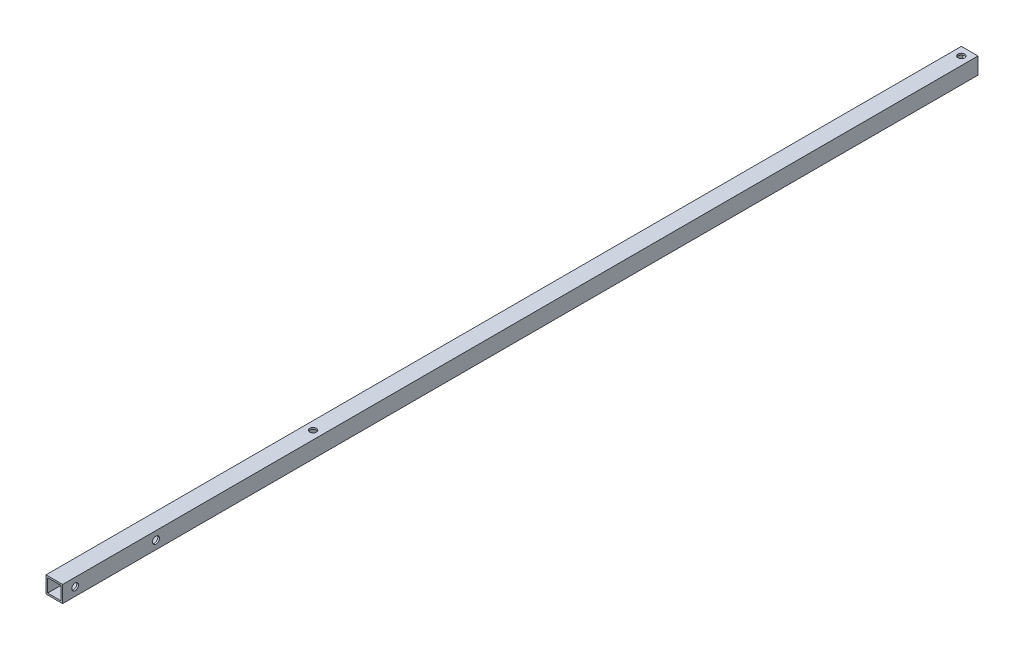
ISO-10303-21;
HEADER;
FILE_DESCRIPTION(('STEP AP214'),'2;1');
FILE_NAME('part.step','',(''),(''),'','','');
FILE_SCHEMA(('AUTOMOTIVE_DESIGN { 1 0 10303 214 1 1 1 1 }'));
ENDSEC;
DATA;
#1=APPLICATION_CONTEXT('core data for automotive mechanical design processes');
#2=APPLICATION_PROTOCOL_DEFINITION('international standard','automotive_design',2000,#1);
#3=PRODUCT_CONTEXT('',#1,'mechanical');
#4=PRODUCT('Part','Part','',(#3));
#5=PRODUCT_RELATED_PRODUCT_CATEGORY('part','',(#4));
#6=PRODUCT_DEFINITION_FORMATION('','',#4);
#7=PRODUCT_DEFINITION_CONTEXT('part definition',#1,'design');
#8=PRODUCT_DEFINITION('design','',#6,#7);
#9=PRODUCT_DEFINITION_SHAPE('','',#8);
#10=(LENGTH_UNIT() NAMED_UNIT(*) SI_UNIT(.MILLI.,.METRE.));
#11=(NAMED_UNIT(*) PLANE_ANGLE_UNIT() SI_UNIT($,.RADIAN.));
#12=(NAMED_UNIT(*) SI_UNIT($,.STERADIAN.) SOLID_ANGLE_UNIT());
#13=UNCERTAINTY_MEASURE_WITH_UNIT(LENGTH_MEASURE(1.E-05),#10,'distance_accuracy_value','');
#14=(GEOMETRIC_REPRESENTATION_CONTEXT(3) GLOBAL_UNCERTAINTY_ASSIGNED_CONTEXT((#13)) GLOBAL_UNIT_ASSIGNED_CONTEXT((#10,
#11,#12)) REPRESENTATION_CONTEXT('',''));
#15=CARTESIAN_POINT('',(0.,0.,0.));
#16=DIRECTION('',(0.,0.,1.));
#17=DIRECTION('',(1.,0.,0.));
#18=AXIS2_PLACEMENT_3D('',#15,#16,#17);
#19=CARTESIAN_POINT('',(0.,0.,550.));
#20=DIRECTION('',(0.,0.,1.));
#21=DIRECTION('',(1.,0.,0.));
#22=AXIS2_PLACEMENT_3D('',#19,#20,#21);
#23=PLANE('',#22);
#24=DIRECTION('',(0.,1.,0.));
#25=VECTOR('',#24,1.);
#26=CARTESIAN_POINT('',(5.,-5.,550.));
#27=LINE('',#26,#25);
#28=CARTESIAN_POINT('',(5.,-5.,550.));
#29=VERTEX_POINT('',#28);
#30=CARTESIAN_POINT('',(5.,5.,550.));
#31=VERTEX_POINT('',#30);
#32=EDGE_CURVE('E164',#29,#31,#27,.T.);
#33=ORIENTED_EDGE('',*,*,#32,.T.);
#34=DIRECTION('',(-1.,0.,0.));
#35=VECTOR('',#34,1.);
#36=CARTESIAN_POINT('',(-5.,5.,550.));
#37=LINE('',#36,#35);
#38=CARTESIAN_POINT('',(-5.,5.,550.));
#39=VERTEX_POINT('',#38);
#40=EDGE_CURVE('E167',#31,#39,#37,.T.);
#41=ORIENTED_EDGE('',*,*,#40,.T.);
#42=DIRECTION('',(0.,-1.,0.));
#43=VECTOR('',#42,1.);
#44=CARTESIAN_POINT('',(-5.,-5.,550.));
#45=LINE('',#44,#43);
#46=CARTESIAN_POINT('',(-5.,-5.,550.));
#47=VERTEX_POINT('',#46);
#48=EDGE_CURVE('E170',#39,#47,#45,.T.);
#49=ORIENTED_EDGE('',*,*,#48,.T.);
#50=DIRECTION('',(1.,0.,0.));
#51=VECTOR('',#50,1.);
#52=CARTESIAN_POINT('',(-5.,-5.,550.));
#53=LINE('',#52,#51);
#54=EDGE_CURVE('E172',#47,#29,#53,.T.);
#55=ORIENTED_EDGE('',*,*,#54,.T.);
#56=EDGE_LOOP('',(#33,#41,#49,#55));
#57=FACE_BOUND('',#56,.T.);
#58=DIRECTION('',(-1.,0.,0.));
#59=VECTOR('',#58,1.);
#60=CARTESIAN_POINT('',(0.,4.,550.));
#61=LINE('',#60,#59);
#62=CARTESIAN_POINT('',(4.,4.,550.));
#63=VERTEX_POINT('',#62);
#64=CARTESIAN_POINT('',(-4.,4.,550.));
#65=VERTEX_POINT('',#64);
#66=EDGE_CURVE('E134',#63,#65,#61,.T.);
#67=ORIENTED_EDGE('',*,*,#66,.F.);
#68=DIRECTION('',(0.,1.,0.));
#69=VECTOR('',#68,1.);
#70=CARTESIAN_POINT('',(4.,0.,550.));
#71=LINE('',#70,#69);
#72=CARTESIAN_POINT('',(4.,-4.,550.));
#73=VERTEX_POINT('',#72);
#74=EDGE_CURVE('E126',#73,#63,#71,.T.);
#75=ORIENTED_EDGE('',*,*,#74,.F.);
#76=DIRECTION('',(1.,0.,0.));
#77=VECTOR('',#76,1.);
#78=CARTESIAN_POINT('',(0.,-4.,550.));
#79=LINE('',#78,#77);
#80=CARTESIAN_POINT('',(-4.,-4.,550.));
#81=VERTEX_POINT('',#80);
#82=EDGE_CURVE('E148',#81,#73,#79,.T.);
#83=ORIENTED_EDGE('',*,*,#82,.F.);
#84=DIRECTION('',(0.,-1.,0.));
#85=VECTOR('',#84,1.);
#86=CARTESIAN_POINT('',(-4.,0.,550.));
#87=LINE('',#86,#85);
#88=EDGE_CURVE('E146',#65,#81,#87,.T.);
#89=ORIENTED_EDGE('',*,*,#88,.F.);
#90=EDGE_LOOP('',(#67,#75,#83,#89));
#91=FACE_BOUND('',#90,.T.);
#92=ADVANCED_FACE('F59',(#57,#91),#23,.T.);
#93=CARTESIAN_POINT('',(0.,0.,0.));
#94=DIRECTION('',(0.,0.,1.));
#95=DIRECTION('',(1.,0.,0.));
#96=AXIS2_PLACEMENT_3D('',#93,#94,#95);
#97=PLANE('',#96);
#98=DIRECTION('',(0.,1.,0.));
#99=VECTOR('',#98,1.);
#100=CARTESIAN_POINT('',(5.,-5.,0.));
#101=LINE('',#100,#99);
#102=CARTESIAN_POINT('',(5.,-5.,0.));
#103=VERTEX_POINT('',#102);
#104=CARTESIAN_POINT('',(5.,5.,0.));
#105=VERTEX_POINT('',#104);
#106=EDGE_CURVE('E142',#103,#105,#101,.T.);
#107=ORIENTED_EDGE('',*,*,#106,.F.);
#108=DIRECTION('',(1.,0.,0.));
#109=VECTOR('',#108,1.);
#110=CARTESIAN_POINT('',(-5.,-5.,0.));
#111=LINE('',#110,#109);
#112=CARTESIAN_POINT('',(-5.,-5.,0.));
#113=VERTEX_POINT('',#112);
#114=EDGE_CURVE('E168',#113,#103,#111,.T.);
#115=ORIENTED_EDGE('',*,*,#114,.F.);
#116=DIRECTION('',(0.,-1.,0.));
#117=VECTOR('',#116,1.);
#118=CARTESIAN_POINT('',(-5.,-5.,0.));
#119=LINE('',#118,#117);
#120=CARTESIAN_POINT('',(-5.,5.,0.));
#121=VERTEX_POINT('',#120);
#122=EDGE_CURVE('E179',#121,#113,#119,.T.);
#123=ORIENTED_EDGE('',*,*,#122,.F.);
#124=DIRECTION('',(-1.,0.,0.));
#125=VECTOR('',#124,1.);
#126=CARTESIAN_POINT('',(-5.,5.,0.));
#127=LINE('',#126,#125);
#128=EDGE_CURVE('E177',#105,#121,#127,.T.);
#129=ORIENTED_EDGE('',*,*,#128,.F.);
#130=EDGE_LOOP('',(#107,#115,#123,#129));
#131=FACE_BOUND('',#130,.T.);
#132=DIRECTION('',(0.,1.,0.));
#133=VECTOR('',#132,1.);
#134=CARTESIAN_POINT('',(4.,0.,0.));
#135=LINE('',#134,#133);
#136=CARTESIAN_POINT('',(4.,-4.,0.));
#137=VERTEX_POINT('',#136);
#138=CARTESIAN_POINT('',(4.,4.,0.));
#139=VERTEX_POINT('',#138);
#140=EDGE_CURVE('E84',#137,#139,#135,.T.);
#141=ORIENTED_EDGE('',*,*,#140,.T.);
#142=DIRECTION('',(-1.,0.,0.));
#143=VECTOR('',#142,1.);
#144=CARTESIAN_POINT('',(0.,4.,0.));
#145=LINE('',#144,#143);
#146=CARTESIAN_POINT('',(-4.,4.,0.));
#147=VERTEX_POINT('',#146);
#148=EDGE_CURVE('E141',#139,#147,#145,.T.);
#149=ORIENTED_EDGE('',*,*,#148,.T.);
#150=DIRECTION('',(0.,-1.,0.));
#151=VECTOR('',#150,1.);
#152=CARTESIAN_POINT('',(-4.,0.,0.));
#153=LINE('',#152,#151);
#154=CARTESIAN_POINT('',(-4.,-4.,0.));
#155=VERTEX_POINT('',#154);
#156=EDGE_CURVE('E156',#147,#155,#153,.T.);
#157=ORIENTED_EDGE('',*,*,#156,.T.);
#158=DIRECTION('',(1.,0.,0.));
#159=VECTOR('',#158,1.);
#160=CARTESIAN_POINT('',(0.,-4.,0.));
#161=LINE('',#160,#159);
#162=EDGE_CURVE('E135',#155,#137,#161,.T.);
#163=ORIENTED_EDGE('',*,*,#162,.T.);
#164=EDGE_LOOP('',(#141,#149,#157,#163));
#165=FACE_BOUND('',#164,.T.);
#166=ADVANCED_FACE('F261',(#131,#165),#97,.F.);
#167=CARTESIAN_POINT('',(5.,-5.,550.));
#168=DIRECTION('',(-1.,0.,0.));
#169=DIRECTION('',(0.,0.,1.));
#170=AXIS2_PLACEMENT_3D('',#167,#168,#169);
#171=PLANE('',#170);
#172=CARTESIAN_POINT('',(5.,0.,542.5));
#173=DIRECTION('',(1.,0.,0.));
#174=DIRECTION('',(0.,0.,-1.));
#175=AXIS2_PLACEMENT_3D('',#172,#173,#174);
#176=CIRCLE('',#175,2.);
#177=CARTESIAN_POINT('',(5.,0.,540.5));
#178=VERTEX_POINT('',#177);
#179=EDGE_CURVE('E289',#178,#178,#176,.T.);
#180=ORIENTED_EDGE('',*,*,#179,.F.);
#181=EDGE_LOOP('',(#180));
#182=FACE_BOUND('',#181,.T.);
#183=CARTESIAN_POINT('',(5.,0.,493.91));
#184=DIRECTION('',(1.,0.,0.));
#185=DIRECTION('',(0.,0.,-1.));
#186=AXIS2_PLACEMENT_3D('',#183,#184,#185);
#187=CIRCLE('',#186,2.09999999999999);
#188=CARTESIAN_POINT('',(5.,0.,491.81));
#189=VERTEX_POINT('',#188);
#190=EDGE_CURVE('E206',#189,#189,#187,.T.);
#191=ORIENTED_EDGE('',*,*,#190,.F.);
#192=EDGE_LOOP('',(#191));
#193=FACE_BOUND('',#192,.T.);
#194=ORIENTED_EDGE('',*,*,#106,.T.);
#195=DIRECTION('',(0.,0.,-1.));
#196=VECTOR('',#195,1.);
#197=CARTESIAN_POINT('',(5.,5.,550.));
#198=LINE('',#197,#196);
#199=EDGE_CURVE('E12',#31,#105,#198,.T.);
#200=ORIENTED_EDGE('',*,*,#199,.F.);
#201=ORIENTED_EDGE('',*,*,#32,.F.);
#202=DIRECTION('',(0.,0.,-1.));
#203=VECTOR('',#202,1.);
#204=CARTESIAN_POINT('',(5.,-5.,550.));
#205=LINE('',#204,#203);
#206=EDGE_CURVE('E174',#29,#103,#205,.T.);
#207=ORIENTED_EDGE('',*,*,#206,.T.);
#208=EDGE_LOOP('',(#194,#200,#201,#207));
#209=FACE_BOUND('',#208,.T.);
#210=ADVANCED_FACE('F61',(#182,#193,#209),#171,.F.);
#211=CARTESIAN_POINT('',(-5.,5.,550.));
#212=DIRECTION('',(0.,-1.,0.));
#213=DIRECTION('',(0.,0.,-1.));
#214=AXIS2_PLACEMENT_3D('',#211,#212,#213);
#215=PLANE('',#214);
#216=CARTESIAN_POINT('',(0.,5.,5.));
#217=DIRECTION('',(0.,1.,0.));
#218=DIRECTION('',(0.,0.,1.));
#219=AXIS2_PLACEMENT_3D('',#216,#217,#218);
#220=CIRCLE('',#219,2.);
#221=CARTESIAN_POINT('',(0.,5.,7.));
#222=VERTEX_POINT('',#221);
#223=EDGE_CURVE('E218',#222,#222,#220,.T.);
#224=ORIENTED_EDGE('',*,*,#223,.F.);
#225=EDGE_LOOP('',(#224));
#226=FACE_BOUND('',#225,.T.);
#227=CARTESIAN_POINT('',(0.,5.,394.5));
#228=DIRECTION('',(0.,1.,0.));
#229=DIRECTION('',(0.,0.,1.));
#230=AXIS2_PLACEMENT_3D('',#227,#228,#229);
#231=CIRCLE('',#230,2.);
#232=CARTESIAN_POINT('',(0.,5.,396.5));
#233=VERTEX_POINT('',#232);
#234=EDGE_CURVE('E203',#233,#233,#231,.T.);
#235=ORIENTED_EDGE('',*,*,#234,.F.);
#236=EDGE_LOOP('',(#235));
#237=FACE_BOUND('',#236,.T.);
#238=ORIENTED_EDGE('',*,*,#128,.T.);
#239=DIRECTION('',(0.,0.,-1.));
#240=VECTOR('',#239,1.);
#241=CARTESIAN_POINT('',(-5.,5.,550.));
#242=LINE('',#241,#240);
#243=EDGE_CURVE('E68',#39,#121,#242,.T.);
#244=ORIENTED_EDGE('',*,*,#243,.F.);
#245=ORIENTED_EDGE('',*,*,#40,.F.);
#246=ORIENTED_EDGE('',*,*,#199,.T.);
#247=EDGE_LOOP('',(#238,#244,#245,#246));
#248=FACE_BOUND('',#247,.T.);
#249=ADVANCED_FACE('F247',(#226,#237,#248),#215,.F.);
#250=CARTESIAN_POINT('',(-5.,-5.,550.));
#251=DIRECTION('',(1.,0.,0.));
#252=DIRECTION('',(0.,0.,-1.));
#253=AXIS2_PLACEMENT_3D('',#250,#251,#252);
#254=PLANE('',#253);
#255=CARTESIAN_POINT('',(-5.,0.,542.5));
#256=DIRECTION('',(1.,0.,0.));
#257=DIRECTION('',(0.,0.,-1.));
#258=AXIS2_PLACEMENT_3D('',#255,#256,#257);
#259=CIRCLE('',#258,2.);
#260=CARTESIAN_POINT('',(-5.,0.,540.5));
#261=VERTEX_POINT('',#260);
#262=EDGE_CURVE('E287',#261,#261,#259,.T.);
#263=ORIENTED_EDGE('',*,*,#262,.T.);
#264=EDGE_LOOP('',(#263));
#265=FACE_BOUND('',#264,.T.);
#266=CARTESIAN_POINT('',(-5.,0.,493.91));
#267=DIRECTION('',(1.,0.,0.));
#268=DIRECTION('',(0.,0.,-1.));
#269=AXIS2_PLACEMENT_3D('',#266,#267,#268);
#270=CIRCLE('',#269,2.09999999999999);
#271=CARTESIAN_POINT('',(-5.,0.,491.81));
#272=VERTEX_POINT('',#271);
#273=EDGE_CURVE('E199',#272,#272,#270,.T.);
#274=ORIENTED_EDGE('',*,*,#273,.T.);
#275=EDGE_LOOP('',(#274));
#276=FACE_BOUND('',#275,.T.);
#277=ORIENTED_EDGE('',*,*,#122,.T.);
#278=DIRECTION('',(0.,0.,-1.));
#279=VECTOR('',#278,1.);
#280=CARTESIAN_POINT('',(-5.,-5.,550.));
#281=LINE('',#280,#279);
#282=EDGE_CURVE('E184',#47,#113,#281,.T.);
#283=ORIENTED_EDGE('',*,*,#282,.F.);
#284=ORIENTED_EDGE('',*,*,#48,.F.);
#285=ORIENTED_EDGE('',*,*,#243,.T.);
#286=EDGE_LOOP('',(#277,#283,#284,#285));
#287=FACE_BOUND('',#286,.T.);
#288=ADVANCED_FACE('F250',(#265,#276,#287),#254,.F.);
#289=CARTESIAN_POINT('',(-5.,-5.,550.));
#290=DIRECTION('',(0.,1.,0.));
#291=DIRECTION('',(0.,0.,1.));
#292=AXIS2_PLACEMENT_3D('',#289,#290,#291);
#293=PLANE('',#292);
#294=CARTESIAN_POINT('',(0.,-5.,5.));
#295=DIRECTION('',(0.,1.,0.));
#296=DIRECTION('',(0.,0.,1.));
#297=AXIS2_PLACEMENT_3D('',#294,#295,#296);
#298=CIRCLE('',#297,2.);
#299=CARTESIAN_POINT('',(0.,-5.,7.));
#300=VERTEX_POINT('',#299);
#301=EDGE_CURVE('E193',#300,#300,#298,.T.);
#302=ORIENTED_EDGE('',*,*,#301,.T.);
#303=EDGE_LOOP('',(#302));
#304=FACE_BOUND('',#303,.T.);
#305=CARTESIAN_POINT('',(0.,-5.,394.5));
#306=DIRECTION('',(0.,1.,0.));
#307=DIRECTION('',(0.,0.,1.));
#308=AXIS2_PLACEMENT_3D('',#305,#306,#307);
#309=CIRCLE('',#308,2.);
#310=CARTESIAN_POINT('',(0.,-5.,396.5));
#311=VERTEX_POINT('',#310);
#312=EDGE_CURVE('E221',#311,#311,#309,.T.);
#313=ORIENTED_EDGE('',*,*,#312,.T.);
#314=EDGE_LOOP('',(#313));
#315=FACE_BOUND('',#314,.T.);
#316=ORIENTED_EDGE('',*,*,#114,.T.);
#317=ORIENTED_EDGE('',*,*,#206,.F.);
#318=ORIENTED_EDGE('',*,*,#54,.F.);
#319=ORIENTED_EDGE('',*,*,#282,.T.);
#320=EDGE_LOOP('',(#316,#317,#318,#319));
#321=FACE_BOUND('',#320,.T.);
#322=ADVANCED_FACE('F265',(#304,#315,#321),#293,.F.);
#323=CARTESIAN_POINT('',(4.,0.,550.));
#324=DIRECTION('',(-1.,0.,0.));
#325=DIRECTION('',(0.,0.,1.));
#326=AXIS2_PLACEMENT_3D('',#323,#324,#325);
#327=PLANE('',#326);
#328=CARTESIAN_POINT('',(4.,0.,542.5));
#329=DIRECTION('',(-1.,0.,0.));
#330=DIRECTION('',(0.,0.,1.));
#331=AXIS2_PLACEMENT_3D('',#328,#329,#330);
#332=CIRCLE('',#331,2.);
#333=CARTESIAN_POINT('',(4.,0.,544.5));
#334=VERTEX_POINT('',#333);
#335=EDGE_CURVE('E211',#334,#334,#332,.T.);
#336=ORIENTED_EDGE('',*,*,#335,.F.);
#337=EDGE_LOOP('',(#336));
#338=FACE_BOUND('',#337,.T.);
#339=CARTESIAN_POINT('',(4.,0.,493.91));
#340=DIRECTION('',(-1.,0.,0.));
#341=DIRECTION('',(0.,0.,1.));
#342=AXIS2_PLACEMENT_3D('',#339,#340,#341);
#343=CIRCLE('',#342,2.09999999999999);
#344=CARTESIAN_POINT('',(4.,0.,496.01));
#345=VERTEX_POINT('',#344);
#346=EDGE_CURVE('E198',#345,#345,#343,.T.);
#347=ORIENTED_EDGE('',*,*,#346,.F.);
#348=EDGE_LOOP('',(#347));
#349=FACE_BOUND('',#348,.T.);
#350=ORIENTED_EDGE('',*,*,#140,.F.);
#351=DIRECTION('',(0.,0.,-1.));
#352=VECTOR('',#351,1.);
#353=CARTESIAN_POINT('',(4.,-4.,550.));
#354=LINE('',#353,#352);
#355=EDGE_CURVE('E130',#73,#137,#354,.T.);
#356=ORIENTED_EDGE('',*,*,#355,.F.);
#357=ORIENTED_EDGE('',*,*,#74,.T.);
#358=DIRECTION('',(0.,0.,-1.));
#359=VECTOR('',#358,1.);
#360=CARTESIAN_POINT('',(4.,4.,550.));
#361=LINE('',#360,#359);
#362=EDGE_CURVE('E129',#63,#139,#361,.T.);
#363=ORIENTED_EDGE('',*,*,#362,.T.);
#364=EDGE_LOOP('',(#350,#356,#357,#363));
#365=FACE_BOUND('',#364,.T.);
#366=ADVANCED_FACE('F128',(#338,#349,#365),#327,.T.);
#367=CARTESIAN_POINT('',(0.,4.,550.));
#368=DIRECTION('',(0.,-1.,0.));
#369=DIRECTION('',(0.,0.,-1.));
#370=AXIS2_PLACEMENT_3D('',#367,#368,#369);
#371=PLANE('',#370);
#372=CARTESIAN_POINT('',(0.,4.,5.));
#373=DIRECTION('',(0.,-1.,0.));
#374=DIRECTION('',(0.,0.,-1.));
#375=AXIS2_PLACEMENT_3D('',#372,#373,#374);
#376=CIRCLE('',#375,2.);
#377=CARTESIAN_POINT('',(0.,4.,3.));
#378=VERTEX_POINT('',#377);
#379=EDGE_CURVE('E154',#378,#378,#376,.T.);
#380=ORIENTED_EDGE('',*,*,#379,.F.);
#381=EDGE_LOOP('',(#380));
#382=FACE_BOUND('',#381,.T.);
#383=CARTESIAN_POINT('',(0.,4.,394.5));
#384=DIRECTION('',(0.,-1.,0.));
#385=DIRECTION('',(0.,0.,-1.));
#386=AXIS2_PLACEMENT_3D('',#383,#384,#385);
#387=CIRCLE('',#386,2.);
#388=CARTESIAN_POINT('',(0.,4.,392.5));
#389=VERTEX_POINT('',#388);
#390=EDGE_CURVE('E192',#389,#389,#387,.T.);
#391=ORIENTED_EDGE('',*,*,#390,.F.);
#392=EDGE_LOOP('',(#391));
#393=FACE_BOUND('',#392,.T.);
#394=ORIENTED_EDGE('',*,*,#148,.F.);
#395=ORIENTED_EDGE('',*,*,#362,.F.);
#396=ORIENTED_EDGE('',*,*,#66,.T.);
#397=DIRECTION('',(0.,0.,-1.));
#398=VECTOR('',#397,1.);
#399=CARTESIAN_POINT('',(-4.,4.,550.));
#400=LINE('',#399,#398);
#401=EDGE_CURVE('E143',#65,#147,#400,.T.);
#402=ORIENTED_EDGE('',*,*,#401,.T.);
#403=EDGE_LOOP('',(#394,#395,#396,#402));
#404=FACE_BOUND('',#403,.T.);
#405=ADVANCED_FACE('F138',(#382,#393,#404),#371,.T.);
#406=CARTESIAN_POINT('',(-4.,0.,550.));
#407=DIRECTION('',(1.,0.,0.));
#408=DIRECTION('',(0.,0.,-1.));
#409=AXIS2_PLACEMENT_3D('',#406,#407,#408);
#410=PLANE('',#409);
#411=CARTESIAN_POINT('',(-4.,0.,542.5));
#412=DIRECTION('',(1.,0.,0.));
#413=DIRECTION('',(0.,0.,-1.));
#414=AXIS2_PLACEMENT_3D('',#411,#412,#413);
#415=CIRCLE('',#414,2.);
#416=CARTESIAN_POINT('',(-4.,0.,540.5));
#417=VERTEX_POINT('',#416);
#418=EDGE_CURVE('E63',#417,#417,#415,.T.);
#419=ORIENTED_EDGE('',*,*,#418,.F.);
#420=EDGE_LOOP('',(#419));
#421=FACE_BOUND('',#420,.T.);
#422=CARTESIAN_POINT('',(-4.,0.,493.91));
#423=DIRECTION('',(1.,0.,0.));
#424=DIRECTION('',(0.,0.,-1.));
#425=AXIS2_PLACEMENT_3D('',#422,#423,#424);
#426=CIRCLE('',#425,2.09999999999999);
#427=CARTESIAN_POINT('',(-4.,0.,491.81));
#428=VERTEX_POINT('',#427);
#429=EDGE_CURVE('E196',#428,#428,#426,.T.);
#430=ORIENTED_EDGE('',*,*,#429,.F.);
#431=EDGE_LOOP('',(#430));
#432=FACE_BOUND('',#431,.T.);
#433=ORIENTED_EDGE('',*,*,#156,.F.);
#434=ORIENTED_EDGE('',*,*,#401,.F.);
#435=ORIENTED_EDGE('',*,*,#88,.T.);
#436=DIRECTION('',(0.,0.,-1.));
#437=VECTOR('',#436,1.);
#438=CARTESIAN_POINT('',(-4.,-4.,550.));
#439=LINE('',#438,#437);
#440=EDGE_CURVE('E76',#81,#155,#439,.T.);
#441=ORIENTED_EDGE('',*,*,#440,.T.);
#442=EDGE_LOOP('',(#433,#434,#435,#441));
#443=FACE_BOUND('',#442,.T.);
#444=ADVANCED_FACE('F235',(#421,#432,#443),#410,.T.);
#445=CARTESIAN_POINT('',(0.,-4.,550.));
#446=DIRECTION('',(0.,1.,0.));
#447=DIRECTION('',(0.,0.,1.));
#448=AXIS2_PLACEMENT_3D('',#445,#446,#447);
#449=PLANE('',#448);
#450=CARTESIAN_POINT('',(0.,-4.,5.));
#451=DIRECTION('',(0.,1.,0.));
#452=DIRECTION('',(0.,0.,1.));
#453=AXIS2_PLACEMENT_3D('',#450,#451,#452);
#454=CIRCLE('',#453,2.);
#455=CARTESIAN_POINT('',(0.,-4.,7.));
#456=VERTEX_POINT('',#455);
#457=EDGE_CURVE('E194',#456,#456,#454,.T.);
#458=ORIENTED_EDGE('',*,*,#457,.F.);
#459=EDGE_LOOP('',(#458));
#460=FACE_BOUND('',#459,.T.);
#461=CARTESIAN_POINT('',(0.,-4.,394.5));
#462=DIRECTION('',(0.,1.,0.));
#463=DIRECTION('',(0.,0.,1.));
#464=AXIS2_PLACEMENT_3D('',#461,#462,#463);
#465=CIRCLE('',#464,2.);
#466=CARTESIAN_POINT('',(0.,-4.,396.5));
#467=VERTEX_POINT('',#466);
#468=EDGE_CURVE('E189',#467,#467,#465,.T.);
#469=ORIENTED_EDGE('',*,*,#468,.F.);
#470=EDGE_LOOP('',(#469));
#471=FACE_BOUND('',#470,.T.);
#472=ORIENTED_EDGE('',*,*,#162,.F.);
#473=ORIENTED_EDGE('',*,*,#440,.F.);
#474=ORIENTED_EDGE('',*,*,#82,.T.);
#475=ORIENTED_EDGE('',*,*,#355,.T.);
#476=EDGE_LOOP('',(#472,#473,#474,#475));
#477=FACE_BOUND('',#476,.T.);
#478=ADVANCED_FACE('F318',(#460,#471,#477),#449,.T.);
#479=CARTESIAN_POINT('',(0.,-5.,394.5));
#480=DIRECTION('',(0.,1.,0.));
#481=DIRECTION('',(0.,0.,1.));
#482=AXIS2_PLACEMENT_3D('',#479,#480,#481);
#483=CYLINDRICAL_SURFACE('',#482,2.);
#484=ORIENTED_EDGE('',*,*,#468,.T.);
#485=EDGE_LOOP('',(#484));
#486=FACE_BOUND('',#485,.T.);
#487=ORIENTED_EDGE('',*,*,#312,.F.);
#488=EDGE_LOOP('',(#487));
#489=FACE_BOUND('',#488,.T.);
#490=ADVANCED_FACE('F244',(#486,#489),#483,.F.);
#491=CARTESIAN_POINT('',(0.,-5.,5.));
#492=DIRECTION('',(0.,1.,0.));
#493=DIRECTION('',(0.,0.,1.));
#494=AXIS2_PLACEMENT_3D('',#491,#492,#493);
#495=CYLINDRICAL_SURFACE('',#494,2.);
#496=ORIENTED_EDGE('',*,*,#457,.T.);
#497=EDGE_LOOP('',(#496));
#498=FACE_BOUND('',#497,.T.);
#499=ORIENTED_EDGE('',*,*,#301,.F.);
#500=EDGE_LOOP('',(#499));
#501=FACE_BOUND('',#500,.T.);
#502=ADVANCED_FACE('F242',(#498,#501),#495,.F.);
#503=ORIENTED_EDGE('',*,*,#390,.T.);
#504=EDGE_LOOP('',(#503));
#505=FACE_BOUND('',#504,.T.);
#506=ORIENTED_EDGE('',*,*,#234,.T.);
#507=EDGE_LOOP('',(#506));
#508=FACE_BOUND('',#507,.T.);
#509=ADVANCED_FACE('F239',(#505,#508),#483,.F.);
#510=ORIENTED_EDGE('',*,*,#379,.T.);
#511=EDGE_LOOP('',(#510));
#512=FACE_BOUND('',#511,.T.);
#513=ORIENTED_EDGE('',*,*,#223,.T.);
#514=EDGE_LOOP('',(#513));
#515=FACE_BOUND('',#514,.T.);
#516=ADVANCED_FACE('F230',(#512,#515),#495,.F.);
#517=CARTESIAN_POINT('',(-5.,0.,493.91));
#518=DIRECTION('',(1.,0.,0.));
#519=DIRECTION('',(0.,0.,-1.));
#520=AXIS2_PLACEMENT_3D('',#517,#518,#519);
#521=CYLINDRICAL_SURFACE('',#520,2.09999999999999);
#522=ORIENTED_EDGE('',*,*,#429,.T.);
#523=EDGE_LOOP('',(#522));
#524=FACE_BOUND('',#523,.T.);
#525=ORIENTED_EDGE('',*,*,#273,.F.);
#526=EDGE_LOOP('',(#525));
#527=FACE_BOUND('',#526,.T.);
#528=ADVANCED_FACE('F304',(#524,#527),#521,.F.);
#529=ORIENTED_EDGE('',*,*,#346,.T.);
#530=EDGE_LOOP('',(#529));
#531=FACE_BOUND('',#530,.T.);
#532=ORIENTED_EDGE('',*,*,#190,.T.);
#533=EDGE_LOOP('',(#532));
#534=FACE_BOUND('',#533,.T.);
#535=ADVANCED_FACE('F301',(#531,#534),#521,.F.);
#536=CARTESIAN_POINT('',(-5.,0.,542.5));
#537=DIRECTION('',(1.,0.,0.));
#538=DIRECTION('',(0.,0.,-1.));
#539=AXIS2_PLACEMENT_3D('',#536,#537,#538);
#540=CYLINDRICAL_SURFACE('',#539,2.);
#541=ORIENTED_EDGE('',*,*,#418,.T.);
#542=EDGE_LOOP('',(#541));
#543=FACE_BOUND('',#542,.T.);
#544=ORIENTED_EDGE('',*,*,#262,.F.);
#545=EDGE_LOOP('',(#544));
#546=FACE_BOUND('',#545,.T.);
#547=ADVANCED_FACE('F303',(#543,#546),#540,.F.);
#548=ORIENTED_EDGE('',*,*,#335,.T.);
#549=EDGE_LOOP('',(#548));
#550=FACE_BOUND('',#549,.T.);
#551=ORIENTED_EDGE('',*,*,#179,.T.);
#552=EDGE_LOOP('',(#551));
#553=FACE_BOUND('',#552,.T.);
#554=ADVANCED_FACE('F295',(#550,#553),#540,.F.);
#555=CLOSED_SHELL('',(#92,#166,#210,#249,#288,#322,#366,#405,#444,#478,#490,#502,#509,#516,#528,
#535,#547,#554));
#556=MANIFOLD_SOLID_BREP('B2',#555);
#557=ADVANCED_BREP_SHAPE_REPRESENTATION('',(#18,#556),#14);
#558=SHAPE_DEFINITION_REPRESENTATION(#9,#557);
ENDSEC;
END-ISO-10303-21;
